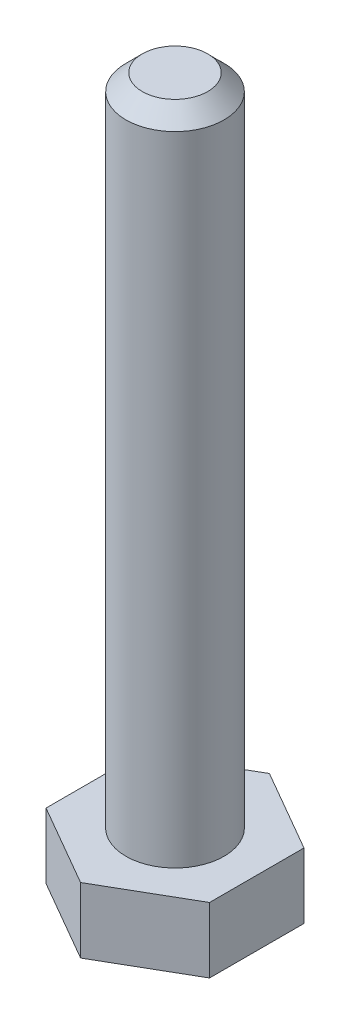
ISO-10303-21;
HEADER;
FILE_DESCRIPTION(('STEP AP214'),'2;1');
FILE_NAME('part.step','',(''),(''),'','','');
FILE_SCHEMA(('AUTOMOTIVE_DESIGN { 1 0 10303 214 1 1 1 1 }'));
ENDSEC;
DATA;
#1=APPLICATION_CONTEXT('core data for automotive mechanical design processes');
#2=APPLICATION_PROTOCOL_DEFINITION('international standard','automotive_design',2000,#1);
#3=PRODUCT_CONTEXT('',#1,'mechanical');
#4=PRODUCT('Part','Part','',(#3));
#5=PRODUCT_RELATED_PRODUCT_CATEGORY('part','',(#4));
#6=PRODUCT_DEFINITION_FORMATION('','',#4);
#7=PRODUCT_DEFINITION_CONTEXT('part definition',#1,'design');
#8=PRODUCT_DEFINITION('design','',#6,#7);
#9=PRODUCT_DEFINITION_SHAPE('','',#8);
#10=(LENGTH_UNIT() NAMED_UNIT(*) SI_UNIT(.MILLI.,.METRE.));
#11=(NAMED_UNIT(*) PLANE_ANGLE_UNIT() SI_UNIT($,.RADIAN.));
#12=(NAMED_UNIT(*) SI_UNIT($,.STERADIAN.) SOLID_ANGLE_UNIT());
#13=UNCERTAINTY_MEASURE_WITH_UNIT(LENGTH_MEASURE(1.E-05),#10,'distance_accuracy_value','');
#14=(GEOMETRIC_REPRESENTATION_CONTEXT(3) GLOBAL_UNCERTAINTY_ASSIGNED_CONTEXT((#13)) GLOBAL_UNIT_ASSIGNED_CONTEXT((#10,
#11,#12)) REPRESENTATION_CONTEXT('',''));
#15=CARTESIAN_POINT('',(0.,0.,0.));
#16=DIRECTION('',(0.,0.,1.));
#17=DIRECTION('',(1.,0.,0.));
#18=AXIS2_PLACEMENT_3D('',#15,#16,#17);
#19=CARTESIAN_POINT('',(4.99999999999997,4.,-2.88675134594819));
#20=DIRECTION('',(-0.499999999999995,0.,0.866025403784441));
#21=DIRECTION('',(0.866025403784441,0.,0.499999999999995));
#22=AXIS2_PLACEMENT_3D('',#19,#20,#21);
#23=PLANE('',#22);
#24=DIRECTION('',(-0.866025403784441,0.,-0.499999999999995));
#25=VECTOR('',#24,1.);
#26=CARTESIAN_POINT('',(4.99999999999997,0.,-2.88675134594819));
#27=LINE('',#26,#25);
#28=CARTESIAN_POINT('',(4.99999999999997,0.,-2.88675134594819));
#29=VERTEX_POINT('',#28);
#30=CARTESIAN_POINT('',(0.,0.,-5.77350269189626));
#31=VERTEX_POINT('',#30);
#32=EDGE_CURVE('E122',#29,#31,#27,.T.);
#33=ORIENTED_EDGE('',*,*,#32,.T.);
#34=DIRECTION('',(0.,-1.,0.));
#35=VECTOR('',#34,1.);
#36=CARTESIAN_POINT('',(0.,4.,-5.77350269189626));
#37=LINE('',#36,#35);
#38=CARTESIAN_POINT('',(0.,4.,-5.77350269189626));
#39=VERTEX_POINT('',#38);
#40=EDGE_CURVE('E139',#39,#31,#37,.T.);
#41=ORIENTED_EDGE('',*,*,#40,.F.);
#42=DIRECTION('',(-0.866025403784441,0.,-0.499999999999995));
#43=VECTOR('',#42,1.);
#44=CARTESIAN_POINT('',(4.99999999999997,4.,-2.88675134594819));
#45=LINE('',#44,#43);
#46=CARTESIAN_POINT('',(4.99999999999997,4.,-2.88675134594819));
#47=VERTEX_POINT('',#46);
#48=EDGE_CURVE('E132',#47,#39,#45,.T.);
#49=ORIENTED_EDGE('',*,*,#48,.F.);
#50=DIRECTION('',(0.,-1.,0.));
#51=VECTOR('',#50,1.);
#52=CARTESIAN_POINT('',(4.99999999999997,4.,-2.88675134594819));
#53=LINE('',#52,#51);
#54=EDGE_CURVE('E118',#47,#29,#53,.T.);
#55=ORIENTED_EDGE('',*,*,#54,.T.);
#56=EDGE_LOOP('',(#33,#41,#49,#55));
#57=FACE_BOUND('',#56,.T.);
#58=ADVANCED_FACE('F35',(#57),#23,.F.);
#59=CARTESIAN_POINT('',(0.,4.,-5.77350269189626));
#60=DIRECTION('',(0.500000000000001,0.,0.866025403784438));
#61=DIRECTION('',(0.866025403784438,0.,-0.500000000000001));
#62=AXIS2_PLACEMENT_3D('',#59,#60,#61);
#63=PLANE('',#62);
#64=DIRECTION('',(-0.866025403784438,0.,0.500000000000001));
#65=VECTOR('',#64,1.);
#66=CARTESIAN_POINT('',(0.,0.,-5.77350269189626));
#67=LINE('',#66,#65);
#68=CARTESIAN_POINT('',(-5.00000000000001,0.,-2.88675134594812));
#69=VERTEX_POINT('',#68);
#70=EDGE_CURVE('E125',#31,#69,#67,.T.);
#71=ORIENTED_EDGE('',*,*,#70,.T.);
#72=DIRECTION('',(0.,-1.,0.));
#73=VECTOR('',#72,1.);
#74=CARTESIAN_POINT('',(-5.00000000000001,4.,-2.88675134594812));
#75=LINE('',#74,#73);
#76=CARTESIAN_POINT('',(-5.00000000000001,4.,-2.88675134594812));
#77=VERTEX_POINT('',#76);
#78=EDGE_CURVE('E136',#77,#69,#75,.T.);
#79=ORIENTED_EDGE('',*,*,#78,.F.);
#80=DIRECTION('',(-0.866025403784438,0.,0.500000000000001));
#81=VECTOR('',#80,1.);
#82=CARTESIAN_POINT('',(0.,4.,-5.77350269189626));
#83=LINE('',#82,#81);
#84=EDGE_CURVE('E91',#39,#77,#83,.T.);
#85=ORIENTED_EDGE('',*,*,#84,.F.);
#86=ORIENTED_EDGE('',*,*,#40,.T.);
#87=EDGE_LOOP('',(#71,#79,#85,#86));
#88=FACE_BOUND('',#87,.T.);
#89=ADVANCED_FACE('F152',(#88),#63,.F.);
#90=CARTESIAN_POINT('',(-5.00000000000001,4.,-2.88675134594812));
#91=DIRECTION('',(1.,0.,0.));
#92=DIRECTION('',(0.,0.,-1.));
#93=AXIS2_PLACEMENT_3D('',#90,#91,#92);
#94=PLANE('',#93);
#95=DIRECTION('',(0.,0.,1.));
#96=VECTOR('',#95,1.);
#97=CARTESIAN_POINT('',(-5.00000000000001,0.,-2.88675134594812));
#98=LINE('',#97,#96);
#99=CARTESIAN_POINT('',(-4.99999999999999,0.,2.88675134594815));
#100=VERTEX_POINT('',#99);
#101=EDGE_CURVE('E127',#69,#100,#98,.T.);
#102=ORIENTED_EDGE('',*,*,#101,.T.);
#103=DIRECTION('',(0.,-1.,0.));
#104=VECTOR('',#103,1.);
#105=CARTESIAN_POINT('',(-4.99999999999999,4.,2.88675134594815));
#106=LINE('',#105,#104);
#107=CARTESIAN_POINT('',(-4.99999999999999,4.,2.88675134594815));
#108=VERTEX_POINT('',#107);
#109=EDGE_CURVE('E113',#108,#100,#106,.T.);
#110=ORIENTED_EDGE('',*,*,#109,.F.);
#111=DIRECTION('',(0.,0.,1.));
#112=VECTOR('',#111,1.);
#113=CARTESIAN_POINT('',(-5.00000000000001,4.,-2.88675134594812));
#114=LINE('',#113,#112);
#115=EDGE_CURVE('E104',#77,#108,#114,.T.);
#116=ORIENTED_EDGE('',*,*,#115,.F.);
#117=ORIENTED_EDGE('',*,*,#78,.T.);
#118=EDGE_LOOP('',(#102,#110,#116,#117));
#119=FACE_BOUND('',#118,.T.);
#120=ADVANCED_FACE('F155',(#119),#94,.F.);
#121=CARTESIAN_POINT('',(-4.99999999999999,4.,2.88675134594815));
#122=DIRECTION('',(0.499999999999995,0.,-0.866025403784442));
#123=DIRECTION('',(-0.866025403784442,0.,-0.499999999999995));
#124=AXIS2_PLACEMENT_3D('',#121,#122,#123);
#125=PLANE('',#124);
#126=DIRECTION('',(0.866025403784442,0.,0.499999999999995));
#127=VECTOR('',#126,1.);
#128=CARTESIAN_POINT('',(-4.99999999999999,0.,2.88675134594815));
#129=LINE('',#128,#127);
#130=CARTESIAN_POINT('',(0.,0.,5.77350269189626));
#131=VERTEX_POINT('',#130);
#132=EDGE_CURVE('E112',#100,#131,#129,.T.);
#133=ORIENTED_EDGE('',*,*,#132,.T.);
#134=DIRECTION('',(0.,-1.,0.));
#135=VECTOR('',#134,1.);
#136=CARTESIAN_POINT('',(0.,4.,5.77350269189626));
#137=LINE('',#136,#135);
#138=CARTESIAN_POINT('',(0.,4.,5.77350269189626));
#139=VERTEX_POINT('',#138);
#140=EDGE_CURVE('E109',#139,#131,#137,.T.);
#141=ORIENTED_EDGE('',*,*,#140,.F.);
#142=DIRECTION('',(0.866025403784442,0.,0.499999999999995));
#143=VECTOR('',#142,1.);
#144=CARTESIAN_POINT('',(-4.99999999999999,4.,2.88675134594815));
#145=LINE('',#144,#143);
#146=EDGE_CURVE('E98',#108,#139,#145,.T.);
#147=ORIENTED_EDGE('',*,*,#146,.F.);
#148=ORIENTED_EDGE('',*,*,#109,.T.);
#149=EDGE_LOOP('',(#133,#141,#147,#148));
#150=FACE_BOUND('',#149,.T.);
#151=ADVANCED_FACE('F110',(#150),#125,.F.);
#152=CARTESIAN_POINT('',(0.,4.,5.77350269189626));
#153=DIRECTION('',(-0.500000000000007,0.,-0.866025403784435));
#154=DIRECTION('',(-0.866025403784435,0.,0.500000000000007));
#155=AXIS2_PLACEMENT_3D('',#152,#153,#154);
#156=PLANE('',#155);
#157=DIRECTION('',(0.866025403784435,0.,-0.500000000000007));
#158=VECTOR('',#157,1.);
#159=CARTESIAN_POINT('',(0.,0.,5.77350269189626));
#160=LINE('',#159,#158);
#161=CARTESIAN_POINT('',(5.00000000000003,0.,2.88675134594808));
#162=VERTEX_POINT('',#161);
#163=EDGE_CURVE('E76',#131,#162,#160,.T.);
#164=ORIENTED_EDGE('',*,*,#163,.T.);
#165=DIRECTION('',(0.,-1.,0.));
#166=VECTOR('',#165,1.);
#167=CARTESIAN_POINT('',(5.00000000000003,4.,2.88675134594808));
#168=LINE('',#167,#166);
#169=CARTESIAN_POINT('',(5.00000000000003,4.,2.88675134594808));
#170=VERTEX_POINT('',#169);
#171=EDGE_CURVE('E114',#170,#162,#168,.T.);
#172=ORIENTED_EDGE('',*,*,#171,.F.);
#173=DIRECTION('',(0.866025403784435,0.,-0.500000000000007));
#174=VECTOR('',#173,1.);
#175=CARTESIAN_POINT('',(0.,4.,5.77350269189626));
#176=LINE('',#175,#174);
#177=EDGE_CURVE('E102',#139,#170,#176,.T.);
#178=ORIENTED_EDGE('',*,*,#177,.F.);
#179=ORIENTED_EDGE('',*,*,#140,.T.);
#180=EDGE_LOOP('',(#164,#172,#178,#179));
#181=FACE_BOUND('',#180,.T.);
#182=ADVANCED_FACE('F116',(#181),#156,.F.);
#183=CARTESIAN_POINT('',(5.00000000000003,4.,2.88675134594808));
#184=DIRECTION('',(-1.,0.,0.));
#185=DIRECTION('',(0.,0.,1.));
#186=AXIS2_PLACEMENT_3D('',#183,#184,#185);
#187=PLANE('',#186);
#188=DIRECTION('',(0.,0.,-1.));
#189=VECTOR('',#188,1.);
#190=CARTESIAN_POINT('',(5.00000000000003,0.,2.88675134594808));
#191=LINE('',#190,#189);
#192=EDGE_CURVE('E82',#162,#29,#191,.T.);
#193=ORIENTED_EDGE('',*,*,#192,.T.);
#194=ORIENTED_EDGE('',*,*,#54,.F.);
#195=DIRECTION('',(0.,0.,-1.));
#196=VECTOR('',#195,1.);
#197=CARTESIAN_POINT('',(5.00000000000003,4.,2.88675134594808));
#198=LINE('',#197,#196);
#199=EDGE_CURVE('E53',#170,#47,#198,.T.);
#200=ORIENTED_EDGE('',*,*,#199,.F.);
#201=ORIENTED_EDGE('',*,*,#171,.T.);
#202=EDGE_LOOP('',(#193,#194,#200,#201));
#203=FACE_BOUND('',#202,.T.);
#204=ADVANCED_FACE('F160',(#203),#187,.F.);
#205=CARTESIAN_POINT('',(0.,4.,0.));
#206=DIRECTION('',(0.,1.,0.));
#207=DIRECTION('',(0.,0.,1.));
#208=AXIS2_PLACEMENT_3D('',#205,#206,#207);
#209=PLANE('',#208);
#210=CARTESIAN_POINT('',(0.,4.,0.));
#211=DIRECTION('',(0.,1.,0.));
#212=DIRECTION('',(0.,0.,1.));
#213=AXIS2_PLACEMENT_3D('',#210,#211,#212);
#214=CIRCLE('',#213,3.);
#215=CARTESIAN_POINT('',(0.,4.,3.));
#216=VERTEX_POINT('',#215);
#217=EDGE_CURVE('E140',#216,#216,#214,.T.);
#218=ORIENTED_EDGE('',*,*,#217,.F.);
#219=EDGE_LOOP('',(#218));
#220=FACE_BOUND('',#219,.T.);
#221=ORIENTED_EDGE('',*,*,#48,.T.);
#222=ORIENTED_EDGE('',*,*,#84,.T.);
#223=ORIENTED_EDGE('',*,*,#115,.T.);
#224=ORIENTED_EDGE('',*,*,#146,.T.);
#225=ORIENTED_EDGE('',*,*,#177,.T.);
#226=ORIENTED_EDGE('',*,*,#199,.T.);
#227=EDGE_LOOP('',(#221,#222,#223,#224,#225,#226));
#228=FACE_BOUND('',#227,.T.);
#229=ADVANCED_FACE('F100',(#220,#228),#209,.T.);
#230=CARTESIAN_POINT('',(0.,0.,0.));
#231=DIRECTION('',(0.,1.,0.));
#232=DIRECTION('',(0.,0.,1.));
#233=AXIS2_PLACEMENT_3D('',#230,#231,#232);
#234=PLANE('',#233);
#235=ORIENTED_EDGE('',*,*,#32,.F.);
#236=ORIENTED_EDGE('',*,*,#192,.F.);
#237=ORIENTED_EDGE('',*,*,#163,.F.);
#238=ORIENTED_EDGE('',*,*,#132,.F.);
#239=ORIENTED_EDGE('',*,*,#101,.F.);
#240=ORIENTED_EDGE('',*,*,#70,.F.);
#241=EDGE_LOOP('',(#235,#236,#237,#238,#239,#240));
#242=FACE_BOUND('',#241,.T.);
#243=ADVANCED_FACE('F158',(#242),#234,.F.);
#244=CARTESIAN_POINT('',(0.,44.,0.));
#245=DIRECTION('',(0.,-1.,0.));
#246=DIRECTION('',(0.,0.,-1.));
#247=AXIS2_PLACEMENT_3D('',#244,#245,#246);
#248=CYLINDRICAL_SURFACE('',#247,3.);
#249=CARTESIAN_POINT('',(0.,43.,0.));
#250=DIRECTION('',(0.,1.,0.));
#251=DIRECTION('',(0.,0.,1.));
#252=AXIS2_PLACEMENT_3D('',#249,#250,#251);
#253=CIRCLE('',#252,3.);
#254=CARTESIAN_POINT('',(0.,43.,3.));
#255=VERTEX_POINT('',#254);
#256=EDGE_CURVE('E11',#255,#255,#253,.F.);
#257=ORIENTED_EDGE('',*,*,#256,.T.);
#258=EDGE_LOOP('',(#257));
#259=FACE_BOUND('',#258,.T.);
#260=ORIENTED_EDGE('',*,*,#217,.T.);
#261=EDGE_LOOP('',(#260));
#262=FACE_BOUND('',#261,.T.);
#263=ADVANCED_FACE('F202',(#259,#262),#248,.T.);
#264=CARTESIAN_POINT('',(0.,44.,0.));
#265=DIRECTION('',(0.,1.,0.));
#266=DIRECTION('',(0.,0.,1.));
#267=AXIS2_PLACEMENT_3D('',#264,#265,#266);
#268=PLANE('',#267);
#269=CARTESIAN_POINT('',(0.,44.,0.));
#270=DIRECTION('',(0.,1.,0.));
#271=DIRECTION('',(0.,0.,1.));
#272=AXIS2_PLACEMENT_3D('',#269,#270,#271);
#273=CIRCLE('',#272,2.00000000000001);
#274=CARTESIAN_POINT('',(0.,44.,2.00000000000001));
#275=VERTEX_POINT('',#274);
#276=EDGE_CURVE('E45',#275,#275,#273,.T.);
#277=ORIENTED_EDGE('',*,*,#276,.T.);
#278=EDGE_LOOP('',(#277));
#279=FACE_BOUND('',#278,.T.);
#280=ADVANCED_FACE('F215',(#279),#268,.T.);
#281=CARTESIAN_POINT('',(0.,44.,0.));
#282=DIRECTION('',(0.,-1.,0.));
#283=DIRECTION('',(0.,0.,-1.));
#284=AXIS2_PLACEMENT_3D('',#281,#282,#283);
#285=CONICAL_SURFACE('',#284,2.00000000000001,0.785398163397447);
#286=ORIENTED_EDGE('',*,*,#256,.F.);
#287=EDGE_LOOP('',(#286));
#288=FACE_BOUND('',#287,.T.);
#289=ORIENTED_EDGE('',*,*,#276,.F.);
#290=EDGE_LOOP('',(#289));
#291=FACE_BOUND('',#290,.T.);
#292=ADVANCED_FACE('F38',(#288,#291),#285,.T.);
#293=CLOSED_SHELL('',(#58,#89,#120,#151,#182,#204,#229,#243,#263,#280,#292));
#294=MANIFOLD_SOLID_BREP('B2',#293);
#295=ADVANCED_BREP_SHAPE_REPRESENTATION('',(#18,#294),#14);
#296=SHAPE_DEFINITION_REPRESENTATION(#9,#295);
ENDSEC;
END-ISO-10303-21;
